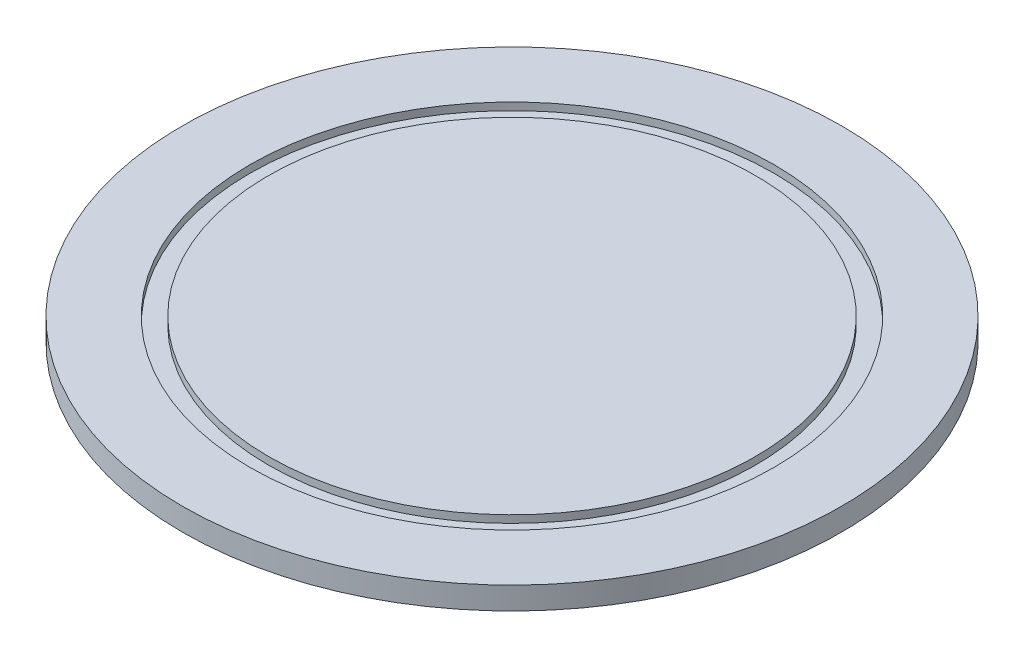
ISO-10303-21;
HEADER;
FILE_DESCRIPTION(('STEP AP214'),'2;1');
FILE_NAME('part.step','',(''),(''),'','','');
FILE_SCHEMA(('AUTOMOTIVE_DESIGN { 1 0 10303 214 1 1 1 1 }'));
ENDSEC;
DATA;
#1=APPLICATION_CONTEXT('core data for automotive mechanical design processes');
#2=APPLICATION_PROTOCOL_DEFINITION('international standard','automotive_design',2000,#1);
#3=PRODUCT_CONTEXT('',#1,'mechanical');
#4=PRODUCT('Part','Part','',(#3));
#5=PRODUCT_RELATED_PRODUCT_CATEGORY('part','',(#4));
#6=PRODUCT_DEFINITION_FORMATION('','',#4);
#7=PRODUCT_DEFINITION_CONTEXT('part definition',#1,'design');
#8=PRODUCT_DEFINITION('design','',#6,#7);
#9=PRODUCT_DEFINITION_SHAPE('','',#8);
#10=(LENGTH_UNIT() NAMED_UNIT(*) SI_UNIT(.MILLI.,.METRE.));
#11=(NAMED_UNIT(*) PLANE_ANGLE_UNIT() SI_UNIT($,.RADIAN.));
#12=(NAMED_UNIT(*) SI_UNIT($,.STERADIAN.) SOLID_ANGLE_UNIT());
#13=UNCERTAINTY_MEASURE_WITH_UNIT(LENGTH_MEASURE(1.E-05),#10,'distance_accuracy_value','');
#14=(GEOMETRIC_REPRESENTATION_CONTEXT(3) GLOBAL_UNCERTAINTY_ASSIGNED_CONTEXT((#13)) GLOBAL_UNIT_ASSIGNED_CONTEXT((#10,
#11,#12)) REPRESENTATION_CONTEXT('',''));
#15=CARTESIAN_POINT('',(0.,0.,0.));
#16=DIRECTION('',(0.,0.,1.));
#17=DIRECTION('',(1.,0.,0.));
#18=AXIS2_PLACEMENT_3D('',#15,#16,#17);
#19=CARTESIAN_POINT('',(0.,15.,0.));
#20=DIRECTION('',(0.,-1.,0.));
#21=DIRECTION('',(0.,0.,-1.));
#22=AXIS2_PLACEMENT_3D('',#19,#20,#21);
#23=CYLINDRICAL_SURFACE('',#22,440.);
#24=CARTESIAN_POINT('',(0.,15.,0.));
#25=DIRECTION('',(0.,1.,0.));
#26=DIRECTION('',(0.,0.,1.));
#27=AXIS2_PLACEMENT_3D('',#24,#25,#26);
#28=CIRCLE('',#27,440.);
#29=CARTESIAN_POINT('',(0.,15.,440.));
#30=VERTEX_POINT('',#29);
#31=EDGE_CURVE('E10',#30,#30,#28,.T.);
#32=ORIENTED_EDGE('',*,*,#31,.F.);
#33=EDGE_LOOP('',(#32));
#34=FACE_BOUND('',#33,.T.);
#35=CARTESIAN_POINT('',(0.,-15.,0.));
#36=DIRECTION('',(0.,1.,0.));
#37=DIRECTION('',(0.,0.,1.));
#38=AXIS2_PLACEMENT_3D('',#35,#36,#37);
#39=CIRCLE('',#38,440.);
#40=CARTESIAN_POINT('',(0.,-15.,440.));
#41=VERTEX_POINT('',#40);
#42=EDGE_CURVE('E34',#41,#41,#39,.T.);
#43=ORIENTED_EDGE('',*,*,#42,.T.);
#44=EDGE_LOOP('',(#43));
#45=FACE_BOUND('',#44,.T.);
#46=ADVANCED_FACE('F31',(#34,#45),#23,.T.);
#47=CARTESIAN_POINT('',(0.,15.,0.));
#48=DIRECTION('',(0.,1.,0.));
#49=DIRECTION('',(0.,0.,1.));
#50=AXIS2_PLACEMENT_3D('',#47,#48,#49);
#51=PLANE('',#50);
#52=CARTESIAN_POINT('',(0.,15.,0.));
#53=DIRECTION('',(0.,1.,0.));
#54=DIRECTION('',(0.,0.,1.));
#55=AXIS2_PLACEMENT_3D('',#52,#53,#54);
#56=CIRCLE('',#55,350.);
#57=CARTESIAN_POINT('',(0.,15.,350.));
#58=VERTEX_POINT('',#57);
#59=EDGE_CURVE('E43',#58,#58,#56,.T.);
#60=ORIENTED_EDGE('',*,*,#59,.F.);
#61=EDGE_LOOP('',(#60));
#62=FACE_BOUND('',#61,.T.);
#63=ORIENTED_EDGE('',*,*,#31,.T.);
#64=EDGE_LOOP('',(#63));
#65=FACE_BOUND('',#64,.T.);
#66=ADVANCED_FACE('F71',(#62,#65),#51,.T.);
#67=CARTESIAN_POINT('',(0.,-15.,0.));
#68=DIRECTION('',(0.,1.,0.));
#69=DIRECTION('',(0.,0.,1.));
#70=AXIS2_PLACEMENT_3D('',#67,#68,#69);
#71=PLANE('',#70);
#72=ORIENTED_EDGE('',*,*,#42,.F.);
#73=EDGE_LOOP('',(#72));
#74=FACE_BOUND('',#73,.T.);
#75=ADVANCED_FACE('F67',(#74),#71,.F.);
#76=CARTESIAN_POINT('',(0.,5.,0.));
#77=DIRECTION('',(0.,1.,0.));
#78=DIRECTION('',(0.,0.,1.));
#79=AXIS2_PLACEMENT_3D('',#76,#77,#78);
#80=CYLINDRICAL_SURFACE('',#79,350.);
#81=CARTESIAN_POINT('',(0.,5.,0.));
#82=DIRECTION('',(0.,1.,0.));
#83=DIRECTION('',(0.,0.,1.));
#84=AXIS2_PLACEMENT_3D('',#81,#82,#83);
#85=CIRCLE('',#84,350.);
#86=CARTESIAN_POINT('',(0.,5.,350.));
#87=VERTEX_POINT('',#86);
#88=EDGE_CURVE('E41',#87,#87,#85,.T.);
#89=ORIENTED_EDGE('',*,*,#88,.F.);
#90=EDGE_LOOP('',(#89));
#91=FACE_BOUND('',#90,.T.);
#92=ORIENTED_EDGE('',*,*,#59,.T.);
#93=EDGE_LOOP('',(#92));
#94=FACE_BOUND('',#93,.T.);
#95=ADVANCED_FACE('F61',(#91,#94),#80,.F.);
#96=CARTESIAN_POINT('',(0.,5.,0.));
#97=DIRECTION('',(0.,1.,0.));
#98=DIRECTION('',(0.,0.,1.));
#99=AXIS2_PLACEMENT_3D('',#96,#97,#98);
#100=PLANE('',#99);
#101=CARTESIAN_POINT('',(0.,5.,0.));
#102=DIRECTION('',(0.,1.,0.));
#103=DIRECTION('',(0.,0.,1.));
#104=AXIS2_PLACEMENT_3D('',#101,#102,#103);
#105=CIRCLE('',#104,325.);
#106=CARTESIAN_POINT('',(0.,5.,325.));
#107=VERTEX_POINT('',#106);
#108=EDGE_CURVE('E46',#107,#107,#105,.T.);
#109=ORIENTED_EDGE('',*,*,#108,.F.);
#110=EDGE_LOOP('',(#109));
#111=FACE_BOUND('',#110,.T.);
#112=ORIENTED_EDGE('',*,*,#88,.T.);
#113=EDGE_LOOP('',(#112));
#114=FACE_BOUND('',#113,.T.);
#115=ADVANCED_FACE('F58',(#111,#114),#100,.T.);
#116=CARTESIAN_POINT('',(0.,5.,0.));
#117=DIRECTION('',(0.,1.,0.));
#118=DIRECTION('',(0.,0.,1.));
#119=AXIS2_PLACEMENT_3D('',#116,#117,#118);
#120=CYLINDRICAL_SURFACE('',#119,325.);
#121=ORIENTED_EDGE('',*,*,#108,.T.);
#122=EDGE_LOOP('',(#121));
#123=FACE_BOUND('',#122,.T.);
#124=CARTESIAN_POINT('',(0.,15.,0.));
#125=DIRECTION('',(0.,1.,0.));
#126=DIRECTION('',(0.,0.,1.));
#127=AXIS2_PLACEMENT_3D('',#124,#125,#126);
#128=CIRCLE('',#127,325.);
#129=CARTESIAN_POINT('',(0.,15.,325.));
#130=VERTEX_POINT('',#129);
#131=EDGE_CURVE('E49',#130,#130,#128,.T.);
#132=ORIENTED_EDGE('',*,*,#131,.F.);
#133=EDGE_LOOP('',(#132));
#134=FACE_BOUND('',#133,.T.);
#135=ADVANCED_FACE('F55',(#123,#134),#120,.T.);
#136=ORIENTED_EDGE('',*,*,#131,.T.);
#137=EDGE_LOOP('',(#136));
#138=FACE_BOUND('',#137,.T.);
#139=ADVANCED_FACE('F74',(#138),#51,.T.);
#140=CLOSED_SHELL('',(#46,#66,#75,#95,#115,#135,#139));
#141=MANIFOLD_SOLID_BREP('B2',#140);
#142=ADVANCED_BREP_SHAPE_REPRESENTATION('',(#18,#141),#14);
#143=SHAPE_DEFINITION_REPRESENTATION(#9,#142);
ENDSEC;
END-ISO-10303-21;
